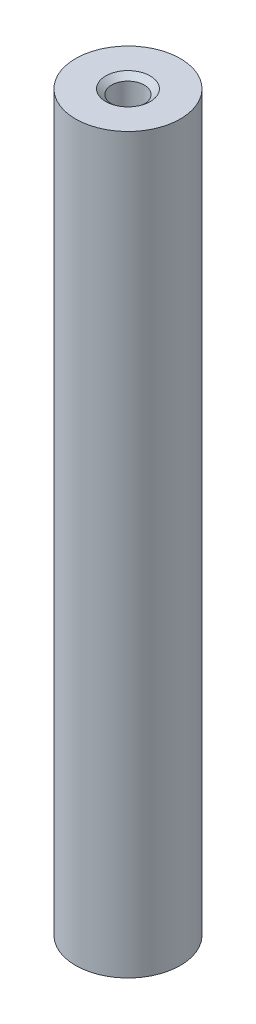
ISO-10303-21;
HEADER;
FILE_DESCRIPTION(('STEP AP214'),'2;1');
FILE_NAME('part.step','',(''),(''),'','','');
FILE_SCHEMA(('AUTOMOTIVE_DESIGN { 1 0 10303 214 1 1 1 1 }'));
ENDSEC;
DATA;
#1=APPLICATION_CONTEXT('core data for automotive mechanical design processes');
#2=APPLICATION_PROTOCOL_DEFINITION('international standard','automotive_design',2000,#1);
#3=PRODUCT_CONTEXT('',#1,'mechanical');
#4=PRODUCT('Part','Part','',(#3));
#5=PRODUCT_RELATED_PRODUCT_CATEGORY('part','',(#4));
#6=PRODUCT_DEFINITION_FORMATION('','',#4);
#7=PRODUCT_DEFINITION_CONTEXT('part definition',#1,'design');
#8=PRODUCT_DEFINITION('design','',#6,#7);
#9=PRODUCT_DEFINITION_SHAPE('','',#8);
#10=(LENGTH_UNIT() NAMED_UNIT(*) SI_UNIT(.MILLI.,.METRE.));
#11=(NAMED_UNIT(*) PLANE_ANGLE_UNIT() SI_UNIT($,.RADIAN.));
#12=(NAMED_UNIT(*) SI_UNIT($,.STERADIAN.) SOLID_ANGLE_UNIT());
#13=UNCERTAINTY_MEASURE_WITH_UNIT(LENGTH_MEASURE(1.E-05),#10,'distance_accuracy_value','');
#14=(GEOMETRIC_REPRESENTATION_CONTEXT(3) GLOBAL_UNCERTAINTY_ASSIGNED_CONTEXT((#13)) GLOBAL_UNIT_ASSIGNED_CONTEXT((#10,
#11,#12)) REPRESENTATION_CONTEXT('',''));
#15=CARTESIAN_POINT('',(0.,0.,0.));
#16=DIRECTION('',(0.,0.,1.));
#17=DIRECTION('',(1.,0.,0.));
#18=AXIS2_PLACEMENT_3D('',#15,#16,#17);
#19=CARTESIAN_POINT('',(0.,177.8,0.));
#20=DIRECTION('',(0.,-1.,0.));
#21=DIRECTION('',(0.,0.,-1.));
#22=AXIS2_PLACEMENT_3D('',#19,#20,#21);
#23=CYLINDRICAL_SURFACE('',#22,12.7);
#24=CARTESIAN_POINT('',(0.,177.8,0.));
#25=DIRECTION('',(0.,1.,0.));
#26=DIRECTION('',(0.,0.,1.));
#27=AXIS2_PLACEMENT_3D('',#24,#25,#26);
#28=CIRCLE('',#27,12.7);
#29=CARTESIAN_POINT('',(0.,177.8,12.7));
#30=VERTEX_POINT('',#29);
#31=EDGE_CURVE('E11',#30,#30,#28,.T.);
#32=ORIENTED_EDGE('',*,*,#31,.F.);
#33=EDGE_LOOP('',(#32));
#34=FACE_BOUND('',#33,.T.);
#35=CARTESIAN_POINT('',(0.,0.,0.));
#36=DIRECTION('',(0.,1.,0.));
#37=DIRECTION('',(0.,0.,1.));
#38=AXIS2_PLACEMENT_3D('',#35,#36,#37);
#39=CIRCLE('',#38,12.7);
#40=CARTESIAN_POINT('',(0.,0.,12.7));
#41=VERTEX_POINT('',#40);
#42=EDGE_CURVE('E52',#41,#41,#39,.T.);
#43=ORIENTED_EDGE('',*,*,#42,.T.);
#44=EDGE_LOOP('',(#43));
#45=FACE_BOUND('',#44,.T.);
#46=ADVANCED_FACE('F49',(#34,#45),#23,.T.);
#47=CARTESIAN_POINT('',(0.,177.8,0.));
#48=DIRECTION('',(0.,1.,0.));
#49=DIRECTION('',(0.,0.,1.));
#50=AXIS2_PLACEMENT_3D('',#47,#48,#49);
#51=PLANE('',#50);
#52=CARTESIAN_POINT('',(0.,177.8,0.));
#53=DIRECTION('',(0.,1.,0.));
#54=DIRECTION('',(0.,0.,1.));
#55=AXIS2_PLACEMENT_3D('',#52,#53,#54);
#56=CIRCLE('',#55,5.3975);
#57=CARTESIAN_POINT('',(0.,177.8,5.3975));
#58=VERTEX_POINT('',#57);
#59=EDGE_CURVE('E79',#58,#58,#56,.T.);
#60=ORIENTED_EDGE('',*,*,#59,.F.);
#61=EDGE_LOOP('',(#60));
#62=FACE_BOUND('',#61,.T.);
#63=ORIENTED_EDGE('',*,*,#31,.T.);
#64=EDGE_LOOP('',(#63));
#65=FACE_BOUND('',#64,.T.);
#66=ADVANCED_FACE('F96',(#62,#65),#51,.T.);
#67=CARTESIAN_POINT('',(0.,0.,0.));
#68=DIRECTION('',(0.,1.,0.));
#69=DIRECTION('',(0.,0.,1.));
#70=AXIS2_PLACEMENT_3D('',#67,#68,#69);
#71=PLANE('',#70);
#72=CARTESIAN_POINT('',(0.,0.,0.));
#73=DIRECTION('',(0.,-1.,0.));
#74=DIRECTION('',(0.,0.,-1.));
#75=AXIS2_PLACEMENT_3D('',#72,#73,#74);
#76=CIRCLE('',#75,6.985);
#77=CARTESIAN_POINT('',(0.,0.,-6.985));
#78=VERTEX_POINT('',#77);
#79=EDGE_CURVE('E72',#78,#78,#76,.T.);
#80=ORIENTED_EDGE('',*,*,#79,.F.);
#81=EDGE_LOOP('',(#80));
#82=FACE_BOUND('',#81,.T.);
#83=ORIENTED_EDGE('',*,*,#42,.F.);
#84=EDGE_LOOP('',(#83));
#85=FACE_BOUND('',#84,.T.);
#86=ADVANCED_FACE('F93',(#82,#85),#71,.F.);
#87=CARTESIAN_POINT('',(0.,25.4,0.));
#88=DIRECTION('',(0.,-1.,0.));
#89=DIRECTION('',(0.,0.,-1.));
#90=AXIS2_PLACEMENT_3D('',#87,#88,#89);
#91=CONICAL_SURFACE('',#90,5.35812999999999,1.02974425867665);
#92=CARTESIAN_POINT('',(0.,28.6194893086301,0.));
#93=VERTEX_POINT('',#92);
#94=VERTEX_LOOP('',#93);
#95=FACE_BOUND('',#94,.T.);
#96=CARTESIAN_POINT('',(0.,25.4,0.));
#97=DIRECTION('',(0.,-1.,0.));
#98=DIRECTION('',(0.,0.,-1.));
#99=AXIS2_PLACEMENT_3D('',#96,#97,#98);
#100=CIRCLE('',#99,5.35812999999999);
#101=CARTESIAN_POINT('',(0.,25.4,-5.35812999999999));
#102=VERTEX_POINT('',#101);
#103=EDGE_CURVE('E85',#102,#102,#100,.T.);
#104=ORIENTED_EDGE('',*,*,#103,.T.);
#105=EDGE_LOOP('',(#104));
#106=FACE_BOUND('',#105,.T.);
#107=ADVANCED_FACE('F95',(#95,#106),#91,.F.);
#108=CARTESIAN_POINT('',(0.,0.,0.));
#109=DIRECTION('',(0.,-1.,0.));
#110=DIRECTION('',(0.,0.,-1.));
#111=AXIS2_PLACEMENT_3D('',#108,#109,#110);
#112=CYLINDRICAL_SURFACE('',#111,5.35813);
#113=ORIENTED_EDGE('',*,*,#103,.F.);
#114=EDGE_LOOP('',(#113));
#115=FACE_BOUND('',#114,.T.);
#116=CARTESIAN_POINT('',(0.,1.36510601697338,0.));
#117=DIRECTION('',(0.,-1.,0.));
#118=DIRECTION('',(0.,0.,-1.));
#119=AXIS2_PLACEMENT_3D('',#116,#117,#118);
#120=CIRCLE('',#119,5.35813);
#121=CARTESIAN_POINT('',(0.,1.36510601697338,-5.35813));
#122=VERTEX_POINT('',#121);
#123=EDGE_CURVE('E76',#122,#122,#120,.T.);
#124=ORIENTED_EDGE('',*,*,#123,.T.);
#125=EDGE_LOOP('',(#124));
#126=FACE_BOUND('',#125,.T.);
#127=ADVANCED_FACE('F103',(#115,#126),#112,.F.);
#128=CARTESIAN_POINT('',(0.,0.,0.));
#129=DIRECTION('',(0.,-1.,0.));
#130=DIRECTION('',(0.,0.,-1.));
#131=AXIS2_PLACEMENT_3D('',#128,#129,#130);
#132=CONICAL_SURFACE('',#131,6.985,0.872664625997166);
#133=ORIENTED_EDGE('',*,*,#123,.F.);
#134=EDGE_LOOP('',(#133));
#135=FACE_BOUND('',#134,.T.);
#136=ORIENTED_EDGE('',*,*,#79,.T.);
#137=EDGE_LOOP('',(#136));
#138=FACE_BOUND('',#137,.T.);
#139=ADVANCED_FACE('F66',(#135,#138),#132,.F.);
#140=CARTESIAN_POINT('',(0.,152.4,0.));
#141=DIRECTION('',(0.,1.,0.));
#142=DIRECTION('',(0.,0.,1.));
#143=AXIS2_PLACEMENT_3D('',#140,#141,#142);
#144=CONICAL_SURFACE('',#143,3.96874999999999,1.02974425867666);
#145=CARTESIAN_POINT('',(0.,150.015334418234,0.));
#146=VERTEX_POINT('',#145);
#147=VERTEX_LOOP('',#146);
#148=FACE_BOUND('',#147,.T.);
#149=CARTESIAN_POINT('',(0.,152.4,0.));
#150=DIRECTION('',(0.,1.,0.));
#151=DIRECTION('',(0.,0.,1.));
#152=AXIS2_PLACEMENT_3D('',#149,#150,#151);
#153=CIRCLE('',#152,3.96874999999999);
#154=CARTESIAN_POINT('',(0.,152.4,3.96874999999999));
#155=VERTEX_POINT('',#154);
#156=EDGE_CURVE('E70',#155,#155,#153,.T.);
#157=ORIENTED_EDGE('',*,*,#156,.T.);
#158=EDGE_LOOP('',(#157));
#159=FACE_BOUND('',#158,.T.);
#160=ADVANCED_FACE('F62',(#148,#159),#144,.F.);
#161=CARTESIAN_POINT('',(0.,177.8,0.));
#162=DIRECTION('',(0.,1.,0.));
#163=DIRECTION('',(0.,0.,1.));
#164=AXIS2_PLACEMENT_3D('',#161,#162,#163);
#165=CYLINDRICAL_SURFACE('',#164,3.96875);
#166=ORIENTED_EDGE('',*,*,#156,.F.);
#167=EDGE_LOOP('',(#166));
#168=FACE_BOUND('',#167,.T.);
#169=CARTESIAN_POINT('',(0.,176.601136401955,0.));
#170=DIRECTION('',(0.,1.,0.));
#171=DIRECTION('',(0.,0.,1.));
#172=AXIS2_PLACEMENT_3D('',#169,#170,#171);
#173=CIRCLE('',#172,3.96875);
#174=CARTESIAN_POINT('',(0.,176.601136401955,3.96875));
#175=VERTEX_POINT('',#174);
#176=EDGE_CURVE('E73',#175,#175,#173,.T.);
#177=ORIENTED_EDGE('',*,*,#176,.T.);
#178=EDGE_LOOP('',(#177));
#179=FACE_BOUND('',#178,.T.);
#180=ADVANCED_FACE('F65',(#168,#179),#165,.F.);
#181=CARTESIAN_POINT('',(0.,177.8,0.));
#182=DIRECTION('',(0.,1.,0.));
#183=DIRECTION('',(0.,0.,1.));
#184=AXIS2_PLACEMENT_3D('',#181,#182,#183);
#185=CONICAL_SURFACE('',#184,5.3975,0.872664625997171);
#186=ORIENTED_EDGE('',*,*,#176,.F.);
#187=EDGE_LOOP('',(#186));
#188=FACE_BOUND('',#187,.T.);
#189=ORIENTED_EDGE('',*,*,#59,.T.);
#190=EDGE_LOOP('',(#189));
#191=FACE_BOUND('',#190,.T.);
#192=ADVANCED_FACE('F161',(#188,#191),#185,.F.);
#193=CLOSED_SHELL('',(#46,#66,#86,#107,#127,#139,#160,#180,#192));
#194=MANIFOLD_SOLID_BREP('B2',#193);
#195=ADVANCED_BREP_SHAPE_REPRESENTATION('',(#18,#194),#14);
#196=SHAPE_DEFINITION_REPRESENTATION(#9,#195);
ENDSEC;
END-ISO-10303-21;
